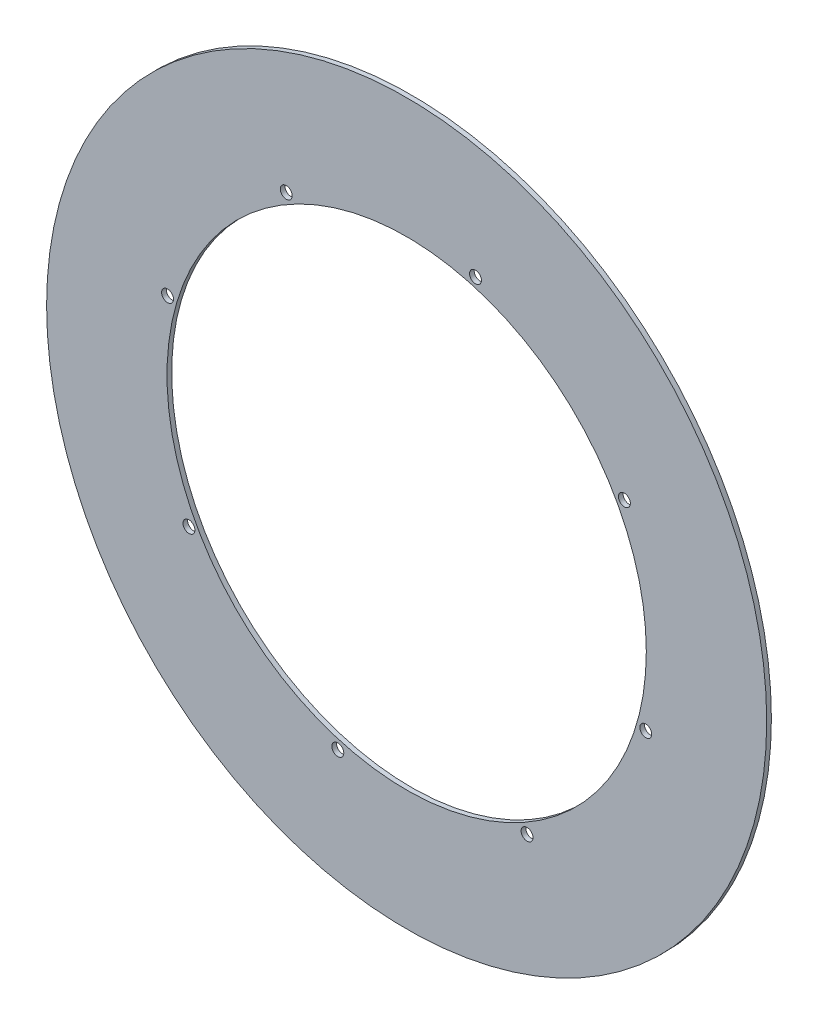
ISO-10303-21;
HEADER;
FILE_DESCRIPTION(('STEP AP214'),'2;1');
FILE_NAME('part.step','',(''),(''),'','','');
FILE_SCHEMA(('AUTOMOTIVE_DESIGN { 1 0 10303 214 1 1 1 1 }'));
ENDSEC;
DATA;
#1=APPLICATION_CONTEXT('core data for automotive mechanical design processes');
#2=APPLICATION_PROTOCOL_DEFINITION('international standard','automotive_design',2000,#1);
#3=PRODUCT_CONTEXT('',#1,'mechanical');
#4=PRODUCT('Part','Part','',(#3));
#5=PRODUCT_RELATED_PRODUCT_CATEGORY('part','',(#4));
#6=PRODUCT_DEFINITION_FORMATION('','',#4);
#7=PRODUCT_DEFINITION_CONTEXT('part definition',#1,'design');
#8=PRODUCT_DEFINITION('design','',#6,#7);
#9=PRODUCT_DEFINITION_SHAPE('','',#8);
#10=(LENGTH_UNIT() NAMED_UNIT(*) SI_UNIT(.MILLI.,.METRE.));
#11=(NAMED_UNIT(*) PLANE_ANGLE_UNIT() SI_UNIT($,.RADIAN.));
#12=(NAMED_UNIT(*) SI_UNIT($,.STERADIAN.) SOLID_ANGLE_UNIT());
#13=UNCERTAINTY_MEASURE_WITH_UNIT(LENGTH_MEASURE(1.E-05),#10,'distance_accuracy_value','');
#14=(GEOMETRIC_REPRESENTATION_CONTEXT(3) GLOBAL_UNCERTAINTY_ASSIGNED_CONTEXT((#13)) GLOBAL_UNIT_ASSIGNED_CONTEXT((#10,
#11,#12)) REPRESENTATION_CONTEXT('',''));
#15=CARTESIAN_POINT('',(0.,0.,0.));
#16=DIRECTION('',(0.,0.,1.));
#17=DIRECTION('',(1.,0.,0.));
#18=AXIS2_PLACEMENT_3D('',#15,#16,#17);
#19=CARTESIAN_POINT('',(0.,0.,2.));
#20=DIRECTION('',(0.,0.,1.));
#21=DIRECTION('',(1.,0.,0.));
#22=AXIS2_PLACEMENT_3D('',#19,#20,#21);
#23=PLANE('',#22);
#24=CARTESIAN_POINT('',(-51.4945917766846,93.1283518267935,2.));
#25=DIRECTION('',(0.,0.,1.));
#26=DIRECTION('',(1.,0.,0.));
#27=AXIS2_PLACEMENT_3D('',#24,#25,#26);
#28=CIRCLE('',#27,2.54473142682005);
#29=CARTESIAN_POINT('',(-48.9498603498645,93.1283518267935,2.));
#30=VERTEX_POINT('',#29);
#31=EDGE_CURVE('E85',#30,#30,#28,.T.);
#32=ORIENTED_EDGE('',*,*,#31,.F.);
#33=EDGE_LOOP('',(#32));
#34=FACE_BOUND('',#33,.T.);
#35=CARTESIAN_POINT('',(-93.1283518267933,-51.4945917766849,2.));
#36=DIRECTION('',(0.,0.,1.));
#37=DIRECTION('',(1.,0.,0.));
#38=AXIS2_PLACEMENT_3D('',#35,#36,#37);
#39=CIRCLE('',#38,2.54473142682005);
#40=CARTESIAN_POINT('',(-90.5836203999733,-51.4945917766849,2.));
#41=VERTEX_POINT('',#40);
#42=EDGE_CURVE('E73',#41,#41,#39,.T.);
#43=ORIENTED_EDGE('',*,*,#42,.F.);
#44=EDGE_LOOP('',(#43));
#45=FACE_BOUND('',#44,.T.);
#46=CARTESIAN_POINT('',(51.4945917766852,-93.1283518267932,2.));
#47=DIRECTION('',(0.,0.,1.));
#48=DIRECTION('',(1.,0.,0.));
#49=AXIS2_PLACEMENT_3D('',#46,#47,#48);
#50=CIRCLE('',#49,2.54473142682005);
#51=CARTESIAN_POINT('',(54.0393232035053,-93.1283518267932,2.));
#52=VERTEX_POINT('',#51);
#53=EDGE_CURVE('E61',#52,#52,#50,.T.);
#54=ORIENTED_EDGE('',*,*,#53,.F.);
#55=EDGE_LOOP('',(#54));
#56=FACE_BOUND('',#55,.T.);
#57=CARTESIAN_POINT('',(102.263864137179,-29.4395140577247,2.));
#58=DIRECTION('',(0.,0.,1.));
#59=DIRECTION('',(1.,0.,0.));
#60=AXIS2_PLACEMENT_3D('',#57,#58,#59);
#61=CIRCLE('',#60,2.54473142682006);
#62=CARTESIAN_POINT('',(104.808595563999,-29.4395140577247,2.));
#63=VERTEX_POINT('',#62);
#64=EDGE_CURVE('E49',#63,#63,#61,.T.);
#65=ORIENTED_EDGE('',*,*,#64,.F.);
#66=EDGE_LOOP('',(#65));
#67=FACE_BOUND('',#66,.T.);
#68=CARTESIAN_POINT('',(0.,0.,2.));
#69=DIRECTION('',(0.,0.,1.));
#70=DIRECTION('',(1.,0.,0.));
#71=AXIS2_PLACEMENT_3D('',#68,#69,#70);
#72=CIRCLE('',#71,154.);
#73=CARTESIAN_POINT('',(154.,0.,2.));
#74=VERTEX_POINT('',#73);
#75=EDGE_CURVE('E10',#74,#74,#72,.T.);
#76=ORIENTED_EDGE('',*,*,#75,.T.);
#77=EDGE_LOOP('',(#76));
#78=FACE_BOUND('',#77,.T.);
#79=CARTESIAN_POINT('',(0.,0.,2.));
#80=DIRECTION('',(0.,0.,1.));
#81=DIRECTION('',(1.,0.,0.));
#82=AXIS2_PLACEMENT_3D('',#79,#80,#81);
#83=CIRCLE('',#82,102.5);
#84=CARTESIAN_POINT('',(102.5,0.,2.));
#85=VERTEX_POINT('',#84);
#86=EDGE_CURVE('E44',#85,#85,#83,.T.);
#87=ORIENTED_EDGE('',*,*,#86,.F.);
#88=EDGE_LOOP('',(#87));
#89=FACE_BOUND('',#88,.T.);
#90=CARTESIAN_POINT('',(93.128351826793,51.4945917766855,2.));
#91=DIRECTION('',(0.,0.,1.));
#92=DIRECTION('',(1.,0.,0.));
#93=AXIS2_PLACEMENT_3D('',#90,#91,#92);
#94=CIRCLE('',#93,2.54473142682005);
#95=CARTESIAN_POINT('',(95.6730832536131,51.4945917766855,2.));
#96=VERTEX_POINT('',#95);
#97=EDGE_CURVE('E55',#96,#96,#94,.T.);
#98=ORIENTED_EDGE('',*,*,#97,.F.);
#99=EDGE_LOOP('',(#98));
#100=FACE_BOUND('',#99,.T.);
#101=CARTESIAN_POINT('',(-29.4395140577244,-102.263864137179,2.));
#102=DIRECTION('',(0.,0.,1.));
#103=DIRECTION('',(1.,0.,0.));
#104=AXIS2_PLACEMENT_3D('',#101,#102,#103);
#105=CIRCLE('',#104,2.54473142682005);
#106=CARTESIAN_POINT('',(-26.8947826309043,-102.263864137179,2.));
#107=VERTEX_POINT('',#106);
#108=EDGE_CURVE('E67',#107,#107,#105,.T.);
#109=ORIENTED_EDGE('',*,*,#108,.F.);
#110=EDGE_LOOP('',(#109));
#111=FACE_BOUND('',#110,.T.);
#112=CARTESIAN_POINT('',(-102.263864137179,29.4395140577255,2.));
#113=DIRECTION('',(0.,0.,1.));
#114=DIRECTION('',(1.,0.,0.));
#115=AXIS2_PLACEMENT_3D('',#112,#113,#114);
#116=CIRCLE('',#115,2.54473142682006);
#117=CARTESIAN_POINT('',(-99.719132710359,29.4395140577255,2.));
#118=VERTEX_POINT('',#117);
#119=EDGE_CURVE('E79',#118,#118,#116,.T.);
#120=ORIENTED_EDGE('',*,*,#119,.F.);
#121=EDGE_LOOP('',(#120));
#122=FACE_BOUND('',#121,.T.);
#123=CARTESIAN_POINT('',(29.4395140577244,102.263864137179,2.));
#124=DIRECTION('',(0.,0.,1.));
#125=DIRECTION('',(1.,0.,0.));
#126=AXIS2_PLACEMENT_3D('',#123,#124,#125);
#127=CIRCLE('',#126,2.54473142682005);
#128=CARTESIAN_POINT('',(31.9842454845444,102.263864137179,2.));
#129=VERTEX_POINT('',#128);
#130=EDGE_CURVE('E91',#129,#129,#127,.T.);
#131=ORIENTED_EDGE('',*,*,#130,.F.);
#132=EDGE_LOOP('',(#131));
#133=FACE_BOUND('',#132,.T.);
#134=ADVANCED_FACE('F33',(#34,#45,#56,#67,#78,#89,#100,#111,#122,#133),#23,.T.);
#135=CARTESIAN_POINT('',(0.,0.,0.));
#136=DIRECTION('',(0.,0.,1.));
#137=DIRECTION('',(1.,0.,0.));
#138=AXIS2_PLACEMENT_3D('',#135,#136,#137);
#139=PLANE('',#138);
#140=CARTESIAN_POINT('',(0.,0.,0.));
#141=DIRECTION('',(0.,0.,1.));
#142=DIRECTION('',(1.,0.,0.));
#143=AXIS2_PLACEMENT_3D('',#140,#141,#142);
#144=CIRCLE('',#143,154.);
#145=CARTESIAN_POINT('',(154.,0.,0.));
#146=VERTEX_POINT('',#145);
#147=EDGE_CURVE('E37',#146,#146,#144,.T.);
#148=ORIENTED_EDGE('',*,*,#147,.F.);
#149=EDGE_LOOP('',(#148));
#150=FACE_BOUND('',#149,.T.);
#151=CARTESIAN_POINT('',(0.,0.,0.));
#152=DIRECTION('',(0.,0.,1.));
#153=DIRECTION('',(1.,0.,0.));
#154=AXIS2_PLACEMENT_3D('',#151,#152,#153);
#155=CIRCLE('',#154,102.5);
#156=CARTESIAN_POINT('',(102.5,0.,0.));
#157=VERTEX_POINT('',#156);
#158=EDGE_CURVE('E46',#157,#157,#155,.T.);
#159=ORIENTED_EDGE('',*,*,#158,.T.);
#160=EDGE_LOOP('',(#159));
#161=FACE_BOUND('',#160,.T.);
#162=CARTESIAN_POINT('',(102.263864137179,-29.4395140577247,0.));
#163=DIRECTION('',(0.,0.,1.));
#164=DIRECTION('',(1.,0.,0.));
#165=AXIS2_PLACEMENT_3D('',#162,#163,#164);
#166=CIRCLE('',#165,2.54473142682006);
#167=CARTESIAN_POINT('',(104.808595563999,-29.4395140577247,0.));
#168=VERTEX_POINT('',#167);
#169=EDGE_CURVE('E52',#168,#168,#166,.T.);
#170=ORIENTED_EDGE('',*,*,#169,.T.);
#171=EDGE_LOOP('',(#170));
#172=FACE_BOUND('',#171,.T.);
#173=CARTESIAN_POINT('',(93.128351826793,51.4945917766855,0.));
#174=DIRECTION('',(0.,0.,1.));
#175=DIRECTION('',(1.,0.,0.));
#176=AXIS2_PLACEMENT_3D('',#173,#174,#175);
#177=CIRCLE('',#176,2.54473142682005);
#178=CARTESIAN_POINT('',(95.6730832536131,51.4945917766855,0.));
#179=VERTEX_POINT('',#178);
#180=EDGE_CURVE('E58',#179,#179,#177,.T.);
#181=ORIENTED_EDGE('',*,*,#180,.T.);
#182=EDGE_LOOP('',(#181));
#183=FACE_BOUND('',#182,.T.);
#184=CARTESIAN_POINT('',(51.4945917766852,-93.1283518267932,0.));
#185=DIRECTION('',(0.,0.,1.));
#186=DIRECTION('',(1.,0.,0.));
#187=AXIS2_PLACEMENT_3D('',#184,#185,#186);
#188=CIRCLE('',#187,2.54473142682005);
#189=CARTESIAN_POINT('',(54.0393232035053,-93.1283518267932,0.));
#190=VERTEX_POINT('',#189);
#191=EDGE_CURVE('E64',#190,#190,#188,.T.);
#192=ORIENTED_EDGE('',*,*,#191,.T.);
#193=EDGE_LOOP('',(#192));
#194=FACE_BOUND('',#193,.T.);
#195=CARTESIAN_POINT('',(-29.4395140577244,-102.263864137179,0.));
#196=DIRECTION('',(0.,0.,1.));
#197=DIRECTION('',(1.,0.,0.));
#198=AXIS2_PLACEMENT_3D('',#195,#196,#197);
#199=CIRCLE('',#198,2.54473142682005);
#200=CARTESIAN_POINT('',(-26.8947826309043,-102.263864137179,0.));
#201=VERTEX_POINT('',#200);
#202=EDGE_CURVE('E70',#201,#201,#199,.T.);
#203=ORIENTED_EDGE('',*,*,#202,.T.);
#204=EDGE_LOOP('',(#203));
#205=FACE_BOUND('',#204,.T.);
#206=CARTESIAN_POINT('',(-93.1283518267933,-51.4945917766849,0.));
#207=DIRECTION('',(0.,0.,1.));
#208=DIRECTION('',(1.,0.,0.));
#209=AXIS2_PLACEMENT_3D('',#206,#207,#208);
#210=CIRCLE('',#209,2.54473142682005);
#211=CARTESIAN_POINT('',(-90.5836203999733,-51.4945917766849,0.));
#212=VERTEX_POINT('',#211);
#213=EDGE_CURVE('E76',#212,#212,#210,.T.);
#214=ORIENTED_EDGE('',*,*,#213,.T.);
#215=EDGE_LOOP('',(#214));
#216=FACE_BOUND('',#215,.T.);
#217=CARTESIAN_POINT('',(-102.263864137179,29.4395140577255,0.));
#218=DIRECTION('',(0.,0.,1.));
#219=DIRECTION('',(1.,0.,0.));
#220=AXIS2_PLACEMENT_3D('',#217,#218,#219);
#221=CIRCLE('',#220,2.54473142682006);
#222=CARTESIAN_POINT('',(-99.719132710359,29.4395140577255,0.));
#223=VERTEX_POINT('',#222);
#224=EDGE_CURVE('E82',#223,#223,#221,.T.);
#225=ORIENTED_EDGE('',*,*,#224,.T.);
#226=EDGE_LOOP('',(#225));
#227=FACE_BOUND('',#226,.T.);
#228=CARTESIAN_POINT('',(-51.4945917766846,93.1283518267935,0.));
#229=DIRECTION('',(0.,0.,1.));
#230=DIRECTION('',(1.,0.,0.));
#231=AXIS2_PLACEMENT_3D('',#228,#229,#230);
#232=CIRCLE('',#231,2.54473142682005);
#233=CARTESIAN_POINT('',(-48.9498603498645,93.1283518267935,0.));
#234=VERTEX_POINT('',#233);
#235=EDGE_CURVE('E88',#234,#234,#232,.T.);
#236=ORIENTED_EDGE('',*,*,#235,.T.);
#237=EDGE_LOOP('',(#236));
#238=FACE_BOUND('',#237,.T.);
#239=CARTESIAN_POINT('',(29.4395140577244,102.263864137179,0.));
#240=DIRECTION('',(0.,0.,1.));
#241=DIRECTION('',(1.,0.,0.));
#242=AXIS2_PLACEMENT_3D('',#239,#240,#241);
#243=CIRCLE('',#242,2.54473142682005);
#244=CARTESIAN_POINT('',(31.9842454845444,102.263864137179,0.));
#245=VERTEX_POINT('',#244);
#246=EDGE_CURVE('E94',#245,#245,#243,.T.);
#247=ORIENTED_EDGE('',*,*,#246,.T.);
#248=EDGE_LOOP('',(#247));
#249=FACE_BOUND('',#248,.T.);
#250=ADVANCED_FACE('F104',(#150,#161,#172,#183,#194,#205,#216,#227,#238,#249),#139,.F.);
#251=CARTESIAN_POINT('',(0.,0.,2.));
#252=DIRECTION('',(0.,0.,-1.));
#253=DIRECTION('',(-1.,0.,0.));
#254=AXIS2_PLACEMENT_3D('',#251,#252,#253);
#255=CYLINDRICAL_SURFACE('',#254,154.);
#256=ORIENTED_EDGE('',*,*,#75,.F.);
#257=EDGE_LOOP('',(#256));
#258=FACE_BOUND('',#257,.T.);
#259=ORIENTED_EDGE('',*,*,#147,.T.);
#260=EDGE_LOOP('',(#259));
#261=FACE_BOUND('',#260,.T.);
#262=ADVANCED_FACE('F35',(#258,#261),#255,.T.);
#263=CARTESIAN_POINT('',(0.,0.,2.));
#264=DIRECTION('',(0.,0.,-1.));
#265=DIRECTION('',(-1.,0.,0.));
#266=AXIS2_PLACEMENT_3D('',#263,#264,#265);
#267=CYLINDRICAL_SURFACE('',#266,102.5);
#268=ORIENTED_EDGE('',*,*,#86,.T.);
#269=EDGE_LOOP('',(#268));
#270=FACE_BOUND('',#269,.T.);
#271=ORIENTED_EDGE('',*,*,#158,.F.);
#272=EDGE_LOOP('',(#271));
#273=FACE_BOUND('',#272,.T.);
#274=ADVANCED_FACE('F114',(#270,#273),#267,.F.);
#275=CARTESIAN_POINT('',(102.263864137179,-29.4395140577247,2.));
#276=DIRECTION('',(0.,0.,-1.));
#277=DIRECTION('',(-1.,0.,0.));
#278=AXIS2_PLACEMENT_3D('',#275,#276,#277);
#279=CYLINDRICAL_SURFACE('',#278,2.54473142682006);
#280=ORIENTED_EDGE('',*,*,#64,.T.);
#281=EDGE_LOOP('',(#280));
#282=FACE_BOUND('',#281,.T.);
#283=ORIENTED_EDGE('',*,*,#169,.F.);
#284=EDGE_LOOP('',(#283));
#285=FACE_BOUND('',#284,.T.);
#286=ADVANCED_FACE('F117',(#282,#285),#279,.F.);
#287=CARTESIAN_POINT('',(93.128351826793,51.4945917766855,2.));
#288=DIRECTION('',(0.,0.,-1.));
#289=DIRECTION('',(-1.,0.,0.));
#290=AXIS2_PLACEMENT_3D('',#287,#288,#289);
#291=CYLINDRICAL_SURFACE('',#290,2.54473142682005);
#292=ORIENTED_EDGE('',*,*,#97,.T.);
#293=EDGE_LOOP('',(#292));
#294=FACE_BOUND('',#293,.T.);
#295=ORIENTED_EDGE('',*,*,#180,.F.);
#296=EDGE_LOOP('',(#295));
#297=FACE_BOUND('',#296,.T.);
#298=ADVANCED_FACE('F121',(#294,#297),#291,.F.);
#299=CARTESIAN_POINT('',(51.4945917766852,-93.1283518267932,2.));
#300=DIRECTION('',(0.,0.,-1.));
#301=DIRECTION('',(-1.,0.,0.));
#302=AXIS2_PLACEMENT_3D('',#299,#300,#301);
#303=CYLINDRICAL_SURFACE('',#302,2.54473142682005);
#304=ORIENTED_EDGE('',*,*,#53,.T.);
#305=EDGE_LOOP('',(#304));
#306=FACE_BOUND('',#305,.T.);
#307=ORIENTED_EDGE('',*,*,#191,.F.);
#308=EDGE_LOOP('',(#307));
#309=FACE_BOUND('',#308,.T.);
#310=ADVANCED_FACE('F125',(#306,#309),#303,.F.);
#311=CARTESIAN_POINT('',(-29.4395140577244,-102.263864137179,2.));
#312=DIRECTION('',(0.,0.,-1.));
#313=DIRECTION('',(-1.,0.,0.));
#314=AXIS2_PLACEMENT_3D('',#311,#312,#313);
#315=CYLINDRICAL_SURFACE('',#314,2.54473142682005);
#316=ORIENTED_EDGE('',*,*,#108,.T.);
#317=EDGE_LOOP('',(#316));
#318=FACE_BOUND('',#317,.T.);
#319=ORIENTED_EDGE('',*,*,#202,.F.);
#320=EDGE_LOOP('',(#319));
#321=FACE_BOUND('',#320,.T.);
#322=ADVANCED_FACE('F129',(#318,#321),#315,.F.);
#323=CARTESIAN_POINT('',(-93.1283518267933,-51.4945917766849,2.));
#324=DIRECTION('',(0.,0.,-1.));
#325=DIRECTION('',(-1.,0.,0.));
#326=AXIS2_PLACEMENT_3D('',#323,#324,#325);
#327=CYLINDRICAL_SURFACE('',#326,2.54473142682005);
#328=ORIENTED_EDGE('',*,*,#42,.T.);
#329=EDGE_LOOP('',(#328));
#330=FACE_BOUND('',#329,.T.);
#331=ORIENTED_EDGE('',*,*,#213,.F.);
#332=EDGE_LOOP('',(#331));
#333=FACE_BOUND('',#332,.T.);
#334=ADVANCED_FACE('F133',(#330,#333),#327,.F.);
#335=CARTESIAN_POINT('',(-102.263864137179,29.4395140577255,2.));
#336=DIRECTION('',(0.,0.,-1.));
#337=DIRECTION('',(-1.,0.,0.));
#338=AXIS2_PLACEMENT_3D('',#335,#336,#337);
#339=CYLINDRICAL_SURFACE('',#338,2.54473142682006);
#340=ORIENTED_EDGE('',*,*,#119,.T.);
#341=EDGE_LOOP('',(#340));
#342=FACE_BOUND('',#341,.T.);
#343=ORIENTED_EDGE('',*,*,#224,.F.);
#344=EDGE_LOOP('',(#343));
#345=FACE_BOUND('',#344,.T.);
#346=ADVANCED_FACE('F137',(#342,#345),#339,.F.);
#347=CARTESIAN_POINT('',(-51.4945917766846,93.1283518267935,2.));
#348=DIRECTION('',(0.,0.,-1.));
#349=DIRECTION('',(-1.,0.,0.));
#350=AXIS2_PLACEMENT_3D('',#347,#348,#349);
#351=CYLINDRICAL_SURFACE('',#350,2.54473142682005);
#352=ORIENTED_EDGE('',*,*,#31,.T.);
#353=EDGE_LOOP('',(#352));
#354=FACE_BOUND('',#353,.T.);
#355=ORIENTED_EDGE('',*,*,#235,.F.);
#356=EDGE_LOOP('',(#355));
#357=FACE_BOUND('',#356,.T.);
#358=ADVANCED_FACE('F141',(#354,#357),#351,.F.);
#359=CARTESIAN_POINT('',(29.4395140577244,102.263864137179,2.));
#360=DIRECTION('',(0.,0.,-1.));
#361=DIRECTION('',(-1.,0.,0.));
#362=AXIS2_PLACEMENT_3D('',#359,#360,#361);
#363=CYLINDRICAL_SURFACE('',#362,2.54473142682005);
#364=ORIENTED_EDGE('',*,*,#130,.T.);
#365=EDGE_LOOP('',(#364));
#366=FACE_BOUND('',#365,.T.);
#367=ORIENTED_EDGE('',*,*,#246,.F.);
#368=EDGE_LOOP('',(#367));
#369=FACE_BOUND('',#368,.T.);
#370=ADVANCED_FACE('F100',(#366,#369),#363,.F.);
#371=CLOSED_SHELL('',(#134,#250,#262,#274,#286,#298,#310,#322,#334,#346,#358,#370));
#372=MANIFOLD_SOLID_BREP('B2',#371);
#373=ADVANCED_BREP_SHAPE_REPRESENTATION('',(#18,#372),#14);
#374=SHAPE_DEFINITION_REPRESENTATION(#9,#373);
ENDSEC;
END-ISO-10303-21;
